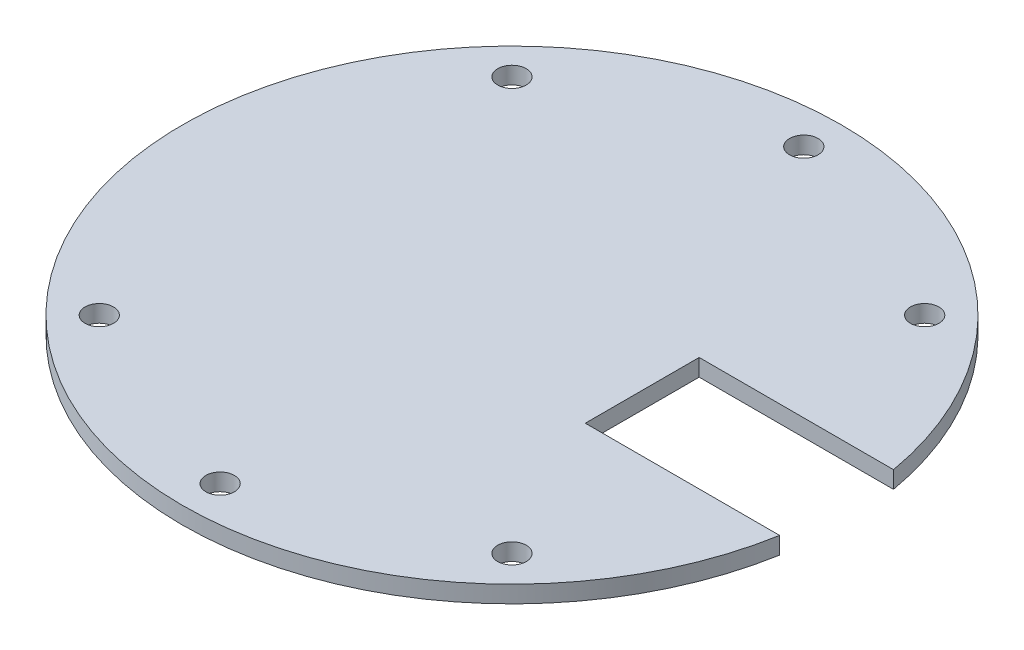
ISO-10303-21;
HEADER;
FILE_DESCRIPTION(('STEP AP214'),'2;1');
FILE_NAME('part.step','',(''),(''),'','','');
FILE_SCHEMA(('AUTOMOTIVE_DESIGN { 1 0 10303 214 1 1 1 1 }'));
ENDSEC;
DATA;
#1=APPLICATION_CONTEXT('core data for automotive mechanical design processes');
#2=APPLICATION_PROTOCOL_DEFINITION('international standard','automotive_design',2000,#1);
#3=PRODUCT_CONTEXT('',#1,'mechanical');
#4=PRODUCT('Part','Part','',(#3));
#5=PRODUCT_RELATED_PRODUCT_CATEGORY('part','',(#4));
#6=PRODUCT_DEFINITION_FORMATION('','',#4);
#7=PRODUCT_DEFINITION_CONTEXT('part definition',#1,'design');
#8=PRODUCT_DEFINITION('design','',#6,#7);
#9=PRODUCT_DEFINITION_SHAPE('','',#8);
#10=(LENGTH_UNIT() NAMED_UNIT(*) SI_UNIT(.MILLI.,.METRE.));
#11=(NAMED_UNIT(*) PLANE_ANGLE_UNIT() SI_UNIT($,.RADIAN.));
#12=(NAMED_UNIT(*) SI_UNIT($,.STERADIAN.) SOLID_ANGLE_UNIT());
#13=UNCERTAINTY_MEASURE_WITH_UNIT(LENGTH_MEASURE(1.E-05),#10,'distance_accuracy_value','');
#14=(GEOMETRIC_REPRESENTATION_CONTEXT(3) GLOBAL_UNCERTAINTY_ASSIGNED_CONTEXT((#13)) GLOBAL_UNIT_ASSIGNED_CONTEXT((#10,
#11,#12)) REPRESENTATION_CONTEXT('',''));
#15=CARTESIAN_POINT('',(0.,0.,0.));
#16=DIRECTION('',(0.,0.,1.));
#17=DIRECTION('',(1.,0.,0.));
#18=AXIS2_PLACEMENT_3D('',#15,#16,#17);
#19=CARTESIAN_POINT('',(0.,1.2,0.));
#20=DIRECTION('',(0.,-1.,0.));
#21=DIRECTION('',(0.,0.,-1.));
#22=AXIS2_PLACEMENT_3D('',#19,#20,#21);
#23=CYLINDRICAL_SURFACE('',#22,23.15);
#24=CARTESIAN_POINT('',(0.,0.,0.));
#25=DIRECTION('',(0.,1.,0.));
#26=DIRECTION('',(0.,0.,1.));
#27=AXIS2_PLACEMENT_3D('',#24,#25,#26);
#28=CIRCLE('',#27,23.15);
#29=CARTESIAN_POINT('',(22.8018091387504,0.,-4.));
#30=VERTEX_POINT('',#29);
#31=CARTESIAN_POINT('',(22.8018091387504,0.,4.));
#32=VERTEX_POINT('',#31);
#33=EDGE_CURVE('E140',#30,#32,#28,.T.);
#34=ORIENTED_EDGE('',*,*,#33,.T.);
#35=DIRECTION('',(0.,-1.,0.));
#36=VECTOR('',#35,1.);
#37=CARTESIAN_POINT('',(22.8018091387504,1.2,4.));
#38=LINE('',#37,#36);
#39=CARTESIAN_POINT('',(22.8018091387504,1.2,4.));
#40=VERTEX_POINT('',#39);
#41=EDGE_CURVE('E63',#32,#40,#38,.F.);
#42=ORIENTED_EDGE('',*,*,#41,.T.);
#43=CARTESIAN_POINT('',(0.,1.2,0.));
#44=DIRECTION('',(0.,1.,0.));
#45=DIRECTION('',(0.,0.,1.));
#46=AXIS2_PLACEMENT_3D('',#43,#44,#45);
#47=CIRCLE('',#46,23.15);
#48=CARTESIAN_POINT('',(22.8018091387504,1.2,-4.));
#49=VERTEX_POINT('',#48);
#50=EDGE_CURVE('E136',#49,#40,#47,.T.);
#51=ORIENTED_EDGE('',*,*,#50,.F.);
#52=DIRECTION('',(0.,-1.,0.));
#53=VECTOR('',#52,1.);
#54=CARTESIAN_POINT('',(22.8018091387504,1.2,-4.));
#55=LINE('',#54,#53);
#56=EDGE_CURVE('E94',#49,#30,#55,.T.);
#57=ORIENTED_EDGE('',*,*,#56,.T.);
#58=EDGE_LOOP('',(#34,#42,#51,#57));
#59=FACE_BOUND('',#58,.T.);
#60=ADVANCED_FACE('F39',(#59),#23,.T.);
#61=CARTESIAN_POINT('',(0.,1.2,0.));
#62=DIRECTION('',(0.,1.,0.));
#63=DIRECTION('',(0.,0.,1.));
#64=AXIS2_PLACEMENT_3D('',#61,#62,#63);
#65=PLANE('',#64);
#66=CARTESIAN_POINT('',(0.,1.2,-20.5));
#67=DIRECTION('',(0.,1.,0.));
#68=DIRECTION('',(0.,0.,1.));
#69=AXIS2_PLACEMENT_3D('',#66,#67,#68);
#70=CIRCLE('',#69,1.);
#71=CARTESIAN_POINT('',(0.,1.2,-19.5));
#72=VERTEX_POINT('',#71);
#73=EDGE_CURVE('E110',#72,#72,#70,.T.);
#74=ORIENTED_EDGE('',*,*,#73,.F.);
#75=EDGE_LOOP('',(#74));
#76=FACE_BOUND('',#75,.T.);
#77=DIRECTION('',(1.,0.,0.));
#78=VECTOR('',#77,1.);
#79=CARTESIAN_POINT('',(9.15,1.2,4.));
#80=LINE('',#79,#78);
#81=CARTESIAN_POINT('',(9.15,1.2,4.));
#82=VERTEX_POINT('',#81);
#83=EDGE_CURVE('E88',#82,#40,#80,.T.);
#84=ORIENTED_EDGE('',*,*,#83,.F.);
#85=DIRECTION('',(0.,0.,1.));
#86=VECTOR('',#85,1.);
#87=CARTESIAN_POINT('',(9.15,1.2,-4.));
#88=LINE('',#87,#86);
#89=CARTESIAN_POINT('',(9.15,1.2,-4.));
#90=VERTEX_POINT('',#89);
#91=EDGE_CURVE('E82',#90,#82,#88,.T.);
#92=ORIENTED_EDGE('',*,*,#91,.F.);
#93=DIRECTION('',(-1.,0.,0.));
#94=VECTOR('',#93,1.);
#95=CARTESIAN_POINT('',(23.15,1.2,-4.));
#96=LINE('',#95,#94);
#97=EDGE_CURVE('E91',#49,#90,#96,.T.);
#98=ORIENTED_EDGE('',*,*,#97,.F.);
#99=ORIENTED_EDGE('',*,*,#50,.T.);
#100=EDGE_LOOP('',(#84,#92,#98,#99));
#101=FACE_BOUND('',#100,.T.);
#102=CARTESIAN_POINT('',(14.4956890143245,1.2,-14.4956890143248));
#103=DIRECTION('',(0.,1.,0.));
#104=DIRECTION('',(0.,0.,1.));
#105=AXIS2_PLACEMENT_3D('',#102,#103,#104);
#106=CIRCLE('',#105,0.999999999999999);
#107=CARTESIAN_POINT('',(14.4956890143245,1.2,-13.4956890143248));
#108=VERTEX_POINT('',#107);
#109=EDGE_CURVE('E99',#108,#108,#106,.T.);
#110=ORIENTED_EDGE('',*,*,#109,.F.);
#111=EDGE_LOOP('',(#110));
#112=FACE_BOUND('',#111,.T.);
#113=CARTESIAN_POINT('',(14.4956890143257,1.2,14.4956890143236));
#114=DIRECTION('',(0.,1.,0.));
#115=DIRECTION('',(0.,0.,1.));
#116=AXIS2_PLACEMENT_3D('',#113,#114,#115);
#117=CIRCLE('',#116,0.999999999999999);
#118=CARTESIAN_POINT('',(14.4956890143257,1.2,15.4956890143236));
#119=VERTEX_POINT('',#118);
#120=EDGE_CURVE('E115',#119,#119,#117,.T.);
#121=ORIENTED_EDGE('',*,*,#120,.F.);
#122=EDGE_LOOP('',(#121));
#123=FACE_BOUND('',#122,.T.);
#124=CARTESIAN_POINT('',(1.74291407809334E-12,1.2,20.5));
#125=DIRECTION('',(0.,1.,0.));
#126=DIRECTION('',(0.,0.,1.));
#127=AXIS2_PLACEMENT_3D('',#124,#125,#126);
#128=CIRCLE('',#127,1.);
#129=CARTESIAN_POINT('',(1.74291407809334E-12,1.2,21.5));
#130=VERTEX_POINT('',#129);
#131=EDGE_CURVE('E119',#130,#130,#128,.T.);
#132=ORIENTED_EDGE('',*,*,#131,.F.);
#133=EDGE_LOOP('',(#132));
#134=FACE_BOUND('',#133,.T.);
#135=CARTESIAN_POINT('',(-14.4956890143227,1.2,14.4956890143248));
#136=DIRECTION('',(0.,1.,0.));
#137=DIRECTION('',(0.,0.,1.));
#138=AXIS2_PLACEMENT_3D('',#135,#136,#137);
#139=CIRCLE('',#138,0.999999999999999);
#140=CARTESIAN_POINT('',(-14.4956890143227,1.2,15.4956890143248));
#141=VERTEX_POINT('',#140);
#142=EDGE_CURVE('E123',#141,#141,#139,.T.);
#143=ORIENTED_EDGE('',*,*,#142,.F.);
#144=EDGE_LOOP('',(#143));
#145=FACE_BOUND('',#144,.T.);
#146=CARTESIAN_POINT('',(-14.495689014324,1.2,-14.4956890143236));
#147=DIRECTION('',(0.,1.,0.));
#148=DIRECTION('',(0.,0.,1.));
#149=AXIS2_PLACEMENT_3D('',#146,#147,#148);
#150=CIRCLE('',#149,0.999999999999999);
#151=CARTESIAN_POINT('',(-14.495689014324,1.2,-13.4956890143236));
#152=VERTEX_POINT('',#151);
#153=EDGE_CURVE('E127',#152,#152,#150,.T.);
#154=ORIENTED_EDGE('',*,*,#153,.F.);
#155=EDGE_LOOP('',(#154));
#156=FACE_BOUND('',#155,.T.);
#157=ADVANCED_FACE('F101',(#76,#101,#112,#123,#134,#145,#156),#65,.T.);
#158=CARTESIAN_POINT('',(0.,0.,0.));
#159=DIRECTION('',(0.,1.,0.));
#160=DIRECTION('',(0.,0.,1.));
#161=AXIS2_PLACEMENT_3D('',#158,#159,#160);
#162=PLANE('',#161);
#163=CARTESIAN_POINT('',(0.,0.,-20.5));
#164=DIRECTION('',(0.,1.,0.));
#165=DIRECTION('',(0.,0.,1.));
#166=AXIS2_PLACEMENT_3D('',#163,#164,#165);
#167=CIRCLE('',#166,1.);
#168=CARTESIAN_POINT('',(0.,0.,-19.5));
#169=VERTEX_POINT('',#168);
#170=EDGE_CURVE('E42',#169,#169,#167,.T.);
#171=ORIENTED_EDGE('',*,*,#170,.T.);
#172=EDGE_LOOP('',(#171));
#173=FACE_BOUND('',#172,.T.);
#174=CARTESIAN_POINT('',(14.4956890143245,0.,-14.4956890143248));
#175=DIRECTION('',(0.,1.,0.));
#176=DIRECTION('',(0.,0.,1.));
#177=AXIS2_PLACEMENT_3D('',#174,#175,#176);
#178=CIRCLE('',#177,0.999999999999999);
#179=CARTESIAN_POINT('',(14.4956890143245,0.,-13.4956890143248));
#180=VERTEX_POINT('',#179);
#181=EDGE_CURVE('E133',#180,#180,#178,.T.);
#182=ORIENTED_EDGE('',*,*,#181,.T.);
#183=EDGE_LOOP('',(#182));
#184=FACE_BOUND('',#183,.T.);
#185=CARTESIAN_POINT('',(14.4956890143257,0.,14.4956890143236));
#186=DIRECTION('',(0.,1.,0.));
#187=DIRECTION('',(0.,0.,1.));
#188=AXIS2_PLACEMENT_3D('',#185,#186,#187);
#189=CIRCLE('',#188,0.999999999999999);
#190=CARTESIAN_POINT('',(14.4956890143257,0.,15.4956890143236));
#191=VERTEX_POINT('',#190);
#192=EDGE_CURVE('E156',#191,#191,#189,.T.);
#193=ORIENTED_EDGE('',*,*,#192,.T.);
#194=EDGE_LOOP('',(#193));
#195=FACE_BOUND('',#194,.T.);
#196=CARTESIAN_POINT('',(1.74291407809334E-12,0.,20.5));
#197=DIRECTION('',(0.,1.,0.));
#198=DIRECTION('',(0.,0.,1.));
#199=AXIS2_PLACEMENT_3D('',#196,#197,#198);
#200=CIRCLE('',#199,1.);
#201=CARTESIAN_POINT('',(1.74291407809334E-12,0.,21.5));
#202=VERTEX_POINT('',#201);
#203=EDGE_CURVE('E152',#202,#202,#200,.T.);
#204=ORIENTED_EDGE('',*,*,#203,.T.);
#205=EDGE_LOOP('',(#204));
#206=FACE_BOUND('',#205,.T.);
#207=CARTESIAN_POINT('',(-14.4956890143227,0.,14.4956890143248));
#208=DIRECTION('',(0.,1.,0.));
#209=DIRECTION('',(0.,0.,1.));
#210=AXIS2_PLACEMENT_3D('',#207,#208,#209);
#211=CIRCLE('',#210,0.999999999999999);
#212=CARTESIAN_POINT('',(-14.4956890143227,0.,15.4956890143248));
#213=VERTEX_POINT('',#212);
#214=EDGE_CURVE('E148',#213,#213,#211,.T.);
#215=ORIENTED_EDGE('',*,*,#214,.T.);
#216=EDGE_LOOP('',(#215));
#217=FACE_BOUND('',#216,.T.);
#218=CARTESIAN_POINT('',(-14.495689014324,0.,-14.4956890143236));
#219=DIRECTION('',(0.,1.,0.));
#220=DIRECTION('',(0.,0.,1.));
#221=AXIS2_PLACEMENT_3D('',#218,#219,#220);
#222=CIRCLE('',#221,0.999999999999999);
#223=CARTESIAN_POINT('',(-14.495689014324,0.,-13.4956890143236));
#224=VERTEX_POINT('',#223);
#225=EDGE_CURVE('E144',#224,#224,#222,.T.);
#226=ORIENTED_EDGE('',*,*,#225,.T.);
#227=EDGE_LOOP('',(#226));
#228=FACE_BOUND('',#227,.T.);
#229=DIRECTION('',(0.,0.,1.));
#230=VECTOR('',#229,1.);
#231=CARTESIAN_POINT('',(9.15,0.,0.));
#232=LINE('',#231,#230);
#233=CARTESIAN_POINT('',(9.15,0.,-4.));
#234=VERTEX_POINT('',#233);
#235=CARTESIAN_POINT('',(9.15,0.,4.));
#236=VERTEX_POINT('',#235);
#237=EDGE_CURVE('E48',#234,#236,#232,.T.);
#238=ORIENTED_EDGE('',*,*,#237,.T.);
#239=DIRECTION('',(1.,0.,0.));
#240=VECTOR('',#239,1.);
#241=CARTESIAN_POINT('',(0.,0.,4.));
#242=LINE('',#241,#240);
#243=EDGE_CURVE('E11',#236,#32,#242,.T.);
#244=ORIENTED_EDGE('',*,*,#243,.T.);
#245=ORIENTED_EDGE('',*,*,#33,.F.);
#246=DIRECTION('',(-1.,0.,0.));
#247=VECTOR('',#246,1.);
#248=CARTESIAN_POINT('',(0.,0.,-4.));
#249=LINE('',#248,#247);
#250=EDGE_CURVE('E139',#30,#234,#249,.T.);
#251=ORIENTED_EDGE('',*,*,#250,.T.);
#252=EDGE_LOOP('',(#238,#244,#245,#251));
#253=FACE_BOUND('',#252,.T.);
#254=ADVANCED_FACE('F167',(#173,#184,#195,#206,#217,#228,#253),#162,.F.);
#255=CARTESIAN_POINT('',(-14.495689014324,-0.4,-14.4956890143236));
#256=DIRECTION('',(0.,1.,0.));
#257=DIRECTION('',(0.,0.,1.));
#258=AXIS2_PLACEMENT_3D('',#255,#256,#257);
#259=CYLINDRICAL_SURFACE('',#258,0.999999999999999);
#260=ORIENTED_EDGE('',*,*,#153,.T.);
#261=EDGE_LOOP('',(#260));
#262=FACE_BOUND('',#261,.T.);
#263=ORIENTED_EDGE('',*,*,#225,.F.);
#264=EDGE_LOOP('',(#263));
#265=FACE_BOUND('',#264,.T.);
#266=ADVANCED_FACE('F179',(#262,#265),#259,.F.);
#267=CARTESIAN_POINT('',(-14.4956890143227,-0.4,14.4956890143248));
#268=DIRECTION('',(0.,1.,0.));
#269=DIRECTION('',(0.,0.,1.));
#270=AXIS2_PLACEMENT_3D('',#267,#268,#269);
#271=CYLINDRICAL_SURFACE('',#270,0.999999999999999);
#272=ORIENTED_EDGE('',*,*,#142,.T.);
#273=EDGE_LOOP('',(#272));
#274=FACE_BOUND('',#273,.T.);
#275=ORIENTED_EDGE('',*,*,#214,.F.);
#276=EDGE_LOOP('',(#275));
#277=FACE_BOUND('',#276,.T.);
#278=ADVANCED_FACE('F185',(#274,#277),#271,.F.);
#279=CARTESIAN_POINT('',(1.74291407809334E-12,-0.4,20.5));
#280=DIRECTION('',(0.,1.,0.));
#281=DIRECTION('',(0.,0.,1.));
#282=AXIS2_PLACEMENT_3D('',#279,#280,#281);
#283=CYLINDRICAL_SURFACE('',#282,1.);
#284=ORIENTED_EDGE('',*,*,#131,.T.);
#285=EDGE_LOOP('',(#284));
#286=FACE_BOUND('',#285,.T.);
#287=ORIENTED_EDGE('',*,*,#203,.F.);
#288=EDGE_LOOP('',(#287));
#289=FACE_BOUND('',#288,.T.);
#290=ADVANCED_FACE('F189',(#286,#289),#283,.F.);
#291=CARTESIAN_POINT('',(14.4956890143257,-0.4,14.4956890143236));
#292=DIRECTION('',(0.,1.,0.));
#293=DIRECTION('',(0.,0.,1.));
#294=AXIS2_PLACEMENT_3D('',#291,#292,#293);
#295=CYLINDRICAL_SURFACE('',#294,0.999999999999999);
#296=ORIENTED_EDGE('',*,*,#120,.T.);
#297=EDGE_LOOP('',(#296));
#298=FACE_BOUND('',#297,.T.);
#299=ORIENTED_EDGE('',*,*,#192,.F.);
#300=EDGE_LOOP('',(#299));
#301=FACE_BOUND('',#300,.T.);
#302=ADVANCED_FACE('F193',(#298,#301),#295,.F.);
#303=CARTESIAN_POINT('',(14.4956890143245,-0.4,-14.4956890143248));
#304=DIRECTION('',(0.,1.,0.));
#305=DIRECTION('',(0.,0.,1.));
#306=AXIS2_PLACEMENT_3D('',#303,#304,#305);
#307=CYLINDRICAL_SURFACE('',#306,0.999999999999999);
#308=ORIENTED_EDGE('',*,*,#109,.T.);
#309=EDGE_LOOP('',(#308));
#310=FACE_BOUND('',#309,.T.);
#311=ORIENTED_EDGE('',*,*,#181,.F.);
#312=EDGE_LOOP('',(#311));
#313=FACE_BOUND('',#312,.T.);
#314=ADVANCED_FACE('F197',(#310,#313),#307,.F.);
#315=CARTESIAN_POINT('',(9.15,-0.4,4.));
#316=DIRECTION('',(0.,0.,1.));
#317=DIRECTION('',(1.,0.,0.));
#318=AXIS2_PLACEMENT_3D('',#315,#316,#317);
#319=PLANE('',#318);
#320=ORIENTED_EDGE('',*,*,#243,.F.);
#321=DIRECTION('',(0.,1.,0.));
#322=VECTOR('',#321,1.);
#323=CARTESIAN_POINT('',(9.15,-0.4,4.));
#324=LINE('',#323,#322);
#325=EDGE_CURVE('E87',#236,#82,#324,.T.);
#326=ORIENTED_EDGE('',*,*,#325,.T.);
#327=ORIENTED_EDGE('',*,*,#83,.T.);
#328=ORIENTED_EDGE('',*,*,#41,.F.);
#329=EDGE_LOOP('',(#320,#326,#327,#328));
#330=FACE_BOUND('',#329,.T.);
#331=ADVANCED_FACE('F201',(#330),#319,.F.);
#332=CARTESIAN_POINT('',(9.15,-0.4,-4.));
#333=DIRECTION('',(-1.,0.,0.));
#334=DIRECTION('',(0.,0.,1.));
#335=AXIS2_PLACEMENT_3D('',#332,#333,#334);
#336=PLANE('',#335);
#337=DIRECTION('',(0.,1.,0.));
#338=VECTOR('',#337,1.);
#339=CARTESIAN_POINT('',(9.15,-0.4,-4.));
#340=LINE('',#339,#338);
#341=EDGE_CURVE('E55',#234,#90,#340,.T.);
#342=ORIENTED_EDGE('',*,*,#341,.T.);
#343=ORIENTED_EDGE('',*,*,#91,.T.);
#344=ORIENTED_EDGE('',*,*,#325,.F.);
#345=ORIENTED_EDGE('',*,*,#237,.F.);
#346=EDGE_LOOP('',(#342,#343,#344,#345));
#347=FACE_BOUND('',#346,.T.);
#348=ADVANCED_FACE('F79',(#347),#336,.F.);
#349=CARTESIAN_POINT('',(23.15,-0.4,-4.));
#350=DIRECTION('',(0.,0.,-1.));
#351=DIRECTION('',(-1.,0.,0.));
#352=AXIS2_PLACEMENT_3D('',#349,#350,#351);
#353=PLANE('',#352);
#354=ORIENTED_EDGE('',*,*,#97,.T.);
#355=ORIENTED_EDGE('',*,*,#341,.F.);
#356=ORIENTED_EDGE('',*,*,#250,.F.);
#357=ORIENTED_EDGE('',*,*,#56,.F.);
#358=EDGE_LOOP('',(#354,#355,#356,#357));
#359=FACE_BOUND('',#358,.T.);
#360=ADVANCED_FACE('F92',(#359),#353,.F.);
#361=CARTESIAN_POINT('',(0.,-0.4,-20.5));
#362=DIRECTION('',(0.,1.,0.));
#363=DIRECTION('',(0.,0.,1.));
#364=AXIS2_PLACEMENT_3D('',#361,#362,#363);
#365=CYLINDRICAL_SURFACE('',#364,1.);
#366=ORIENTED_EDGE('',*,*,#73,.T.);
#367=EDGE_LOOP('',(#366));
#368=FACE_BOUND('',#367,.T.);
#369=ORIENTED_EDGE('',*,*,#170,.F.);
#370=EDGE_LOOP('',(#369));
#371=FACE_BOUND('',#370,.T.);
#372=ADVANCED_FACE('F205',(#368,#371),#365,.F.);
#373=CLOSED_SHELL('',(#60,#157,#254,#266,#278,#290,#302,#314,#331,#348,#360,#372));
#374=MANIFOLD_SOLID_BREP('B2',#373);
#375=ADVANCED_BREP_SHAPE_REPRESENTATION('',(#18,#374),#14);
#376=SHAPE_DEFINITION_REPRESENTATION(#9,#375);
ENDSEC;
END-ISO-10303-21;
